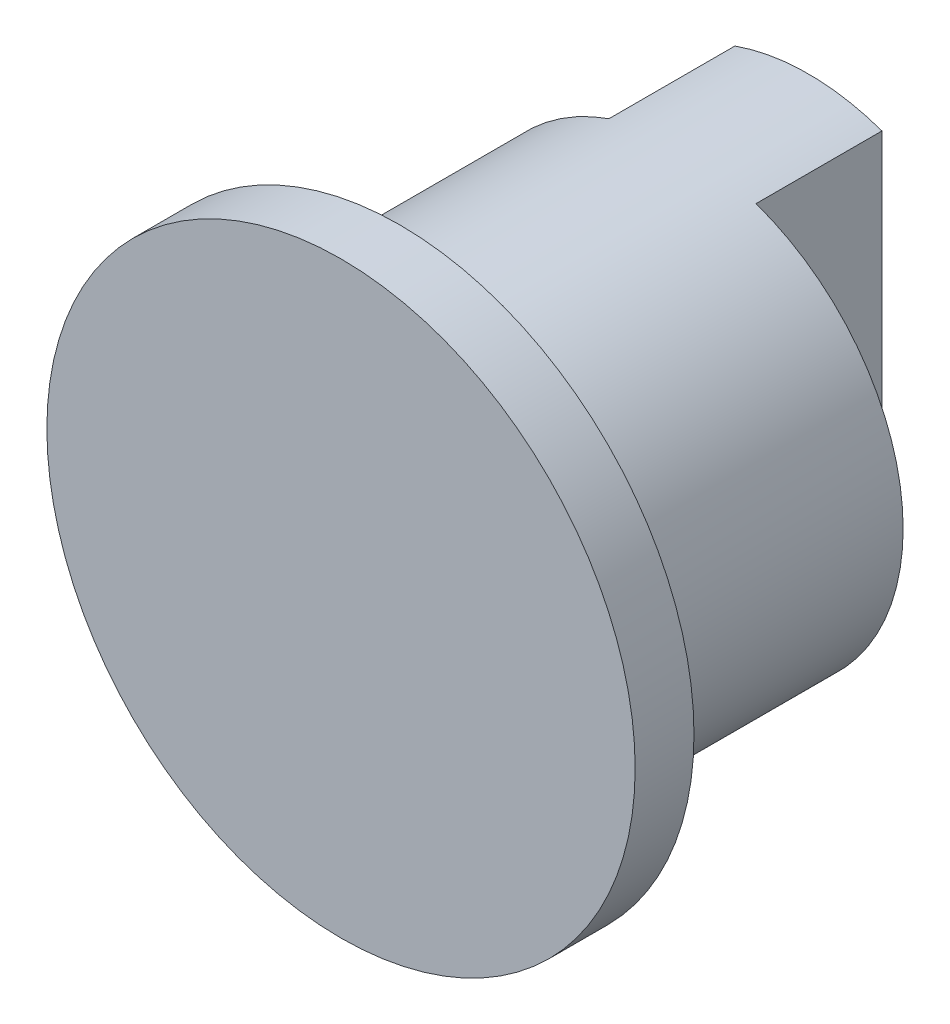
ISO-10303-21;
HEADER;
FILE_DESCRIPTION(('STEP AP214'),'2;1');
FILE_NAME('part.step','',(''),(''),'','','');
FILE_SCHEMA(('AUTOMOTIVE_DESIGN { 1 0 10303 214 1 1 1 1 }'));
ENDSEC;
DATA;
#1=APPLICATION_CONTEXT('core data for automotive mechanical design processes');
#2=APPLICATION_PROTOCOL_DEFINITION('international standard','automotive_design',2000,#1);
#3=PRODUCT_CONTEXT('',#1,'mechanical');
#4=PRODUCT('Part','Part','',(#3));
#5=PRODUCT_RELATED_PRODUCT_CATEGORY('part','',(#4));
#6=PRODUCT_DEFINITION_FORMATION('','',#4);
#7=PRODUCT_DEFINITION_CONTEXT('part definition',#1,'design');
#8=PRODUCT_DEFINITION('design','',#6,#7);
#9=PRODUCT_DEFINITION_SHAPE('','',#8);
#10=(LENGTH_UNIT() NAMED_UNIT(*) SI_UNIT(.MILLI.,.METRE.));
#11=(NAMED_UNIT(*) PLANE_ANGLE_UNIT() SI_UNIT($,.RADIAN.));
#12=(NAMED_UNIT(*) SI_UNIT($,.STERADIAN.) SOLID_ANGLE_UNIT());
#13=UNCERTAINTY_MEASURE_WITH_UNIT(LENGTH_MEASURE(1.E-05),#10,'distance_accuracy_value','');
#14=(GEOMETRIC_REPRESENTATION_CONTEXT(3) GLOBAL_UNCERTAINTY_ASSIGNED_CONTEXT((#13)) GLOBAL_UNIT_ASSIGNED_CONTEXT((#10,
#11,#12)) REPRESENTATION_CONTEXT('',''));
#15=CARTESIAN_POINT('',(0.,0.,0.));
#16=DIRECTION('',(0.,0.,1.));
#17=DIRECTION('',(1.,0.,0.));
#18=AXIS2_PLACEMENT_3D('',#15,#16,#17);
#19=CARTESIAN_POINT('',(0.,0.,10.09015));
#20=DIRECTION('',(0.,0.,-1.));
#21=DIRECTION('',(-1.,0.,0.));
#22=AXIS2_PLACEMENT_3D('',#19,#20,#21);
#23=CYLINDRICAL_SURFACE('',#22,4.7625);
#24=DIRECTION('',(0.,0.,-1.));
#25=VECTOR('',#24,1.);
#26=CARTESIAN_POINT('',(1.5875,-4.49012806053458,10.09015));
#27=LINE('',#26,#25);
#28=CARTESIAN_POINT('',(1.5875,-4.49012806053458,2.7178));
#29=VERTEX_POINT('',#28);
#30=CARTESIAN_POINT('',(1.5875,-4.49012806053458,0.));
#31=VERTEX_POINT('',#30);
#32=EDGE_CURVE('E48',#29,#31,#27,.T.);
#33=ORIENTED_EDGE('',*,*,#32,.F.);
#34=CARTESIAN_POINT('',(0.,0.,2.7178));
#35=DIRECTION('',(0.,0.,-1.));
#36=DIRECTION('',(-1.,0.,0.));
#37=AXIS2_PLACEMENT_3D('',#34,#35,#36);
#38=CIRCLE('',#37,4.7625);
#39=CARTESIAN_POINT('',(1.5875,4.49012806053458,2.7178));
#40=VERTEX_POINT('',#39);
#41=EDGE_CURVE('E74',#40,#29,#38,.T.);
#42=ORIENTED_EDGE('',*,*,#41,.F.);
#43=DIRECTION('',(0.,0.,-1.));
#44=VECTOR('',#43,1.);
#45=CARTESIAN_POINT('',(1.5875,4.49012806053458,10.09015));
#46=LINE('',#45,#44);
#47=CARTESIAN_POINT('',(1.5875,4.49012806053458,0.));
#48=VERTEX_POINT('',#47);
#49=EDGE_CURVE('E77',#48,#40,#46,.F.);
#50=ORIENTED_EDGE('',*,*,#49,.F.);
#51=CARTESIAN_POINT('',(0.,0.,0.));
#52=DIRECTION('',(0.,0.,1.));
#53=DIRECTION('',(1.,0.,0.));
#54=AXIS2_PLACEMENT_3D('',#51,#52,#53);
#55=CIRCLE('',#54,4.7625);
#56=CARTESIAN_POINT('',(-1.5875,4.49012806053458,0.));
#57=VERTEX_POINT('',#56);
#58=EDGE_CURVE('E56',#48,#57,#55,.T.);
#59=ORIENTED_EDGE('',*,*,#58,.T.);
#60=DIRECTION('',(0.,0.,-1.));
#61=VECTOR('',#60,1.);
#62=CARTESIAN_POINT('',(-1.5875,4.49012806053458,10.09015));
#63=LINE('',#62,#61);
#64=CARTESIAN_POINT('',(-1.5875,4.49012806053458,2.7178));
#65=VERTEX_POINT('',#64);
#66=EDGE_CURVE('E98',#65,#57,#63,.T.);
#67=ORIENTED_EDGE('',*,*,#66,.F.);
#68=CARTESIAN_POINT('',(0.,0.,2.7178));
#69=DIRECTION('',(0.,0.,-1.));
#70=DIRECTION('',(-1.,0.,0.));
#71=AXIS2_PLACEMENT_3D('',#68,#69,#70);
#72=CIRCLE('',#71,4.7625);
#73=CARTESIAN_POINT('',(-1.5875,-4.49012806053458,2.7178));
#74=VERTEX_POINT('',#73);
#75=EDGE_CURVE('E104',#74,#65,#72,.T.);
#76=ORIENTED_EDGE('',*,*,#75,.F.);
#77=DIRECTION('',(0.,0.,-1.));
#78=VECTOR('',#77,1.);
#79=CARTESIAN_POINT('',(-1.5875,-4.49012806053458,10.09015));
#80=LINE('',#79,#78);
#81=CARTESIAN_POINT('',(-1.5875,-4.49012806053458,0.));
#82=VERTEX_POINT('',#81);
#83=EDGE_CURVE('E96',#82,#74,#80,.F.);
#84=ORIENTED_EDGE('',*,*,#83,.F.);
#85=EDGE_CURVE('E100',#82,#31,#55,.T.);
#86=ORIENTED_EDGE('',*,*,#85,.T.);
#87=EDGE_LOOP('',(#33,#42,#50,#59,#67,#76,#84,#86));
#88=FACE_BOUND('',#87,.T.);
#89=CARTESIAN_POINT('',(0.,0.,8.82015));
#90=DIRECTION('',(0.,0.,1.));
#91=DIRECTION('',(1.,0.,0.));
#92=AXIS2_PLACEMENT_3D('',#89,#90,#91);
#93=CIRCLE('',#92,4.7625);
#94=CARTESIAN_POINT('',(4.7625,0.,8.82015));
#95=VERTEX_POINT('',#94);
#96=EDGE_CURVE('E11',#95,#95,#93,.T.);
#97=ORIENTED_EDGE('',*,*,#96,.F.);
#98=EDGE_LOOP('',(#97));
#99=FACE_BOUND('',#98,.T.);
#100=ADVANCED_FACE('F33',(#88,#99),#23,.T.);
#101=CARTESIAN_POINT('',(0.,0.,0.));
#102=DIRECTION('',(0.,0.,-1.));
#103=DIRECTION('',(-1.,0.,0.));
#104=AXIS2_PLACEMENT_3D('',#101,#102,#103);
#105=CYLINDRICAL_SURFACE('',#104,1.1303);
#106=CARTESIAN_POINT('',(0.,0.,0.));
#107=DIRECTION('',(0.,0.,-1.));
#108=DIRECTION('',(-1.,0.,0.));
#109=AXIS2_PLACEMENT_3D('',#106,#107,#108);
#110=CIRCLE('',#109,1.1303);
#111=CARTESIAN_POINT('',(-1.1303,0.,0.));
#112=VERTEX_POINT('',#111);
#113=EDGE_CURVE('E86',#112,#112,#110,.T.);
#114=ORIENTED_EDGE('',*,*,#113,.T.);
#115=EDGE_LOOP('',(#114));
#116=FACE_BOUND('',#115,.T.);
#117=CARTESIAN_POINT('',(0.,0.,8.82015));
#118=DIRECTION('',(0.,0.,1.));
#119=DIRECTION('',(1.,0.,0.));
#120=AXIS2_PLACEMENT_3D('',#117,#118,#119);
#121=CIRCLE('',#120,1.1303);
#122=CARTESIAN_POINT('',(1.1303,0.,8.82015));
#123=VERTEX_POINT('',#122);
#124=EDGE_CURVE('E36',#123,#123,#121,.F.);
#125=ORIENTED_EDGE('',*,*,#124,.F.);
#126=EDGE_LOOP('',(#125));
#127=FACE_BOUND('',#126,.T.);
#128=ADVANCED_FACE('F118',(#116,#127),#105,.F.);
#129=CARTESIAN_POINT('',(0.,0.,0.));
#130=DIRECTION('',(0.,0.,1.));
#131=DIRECTION('',(1.,0.,0.));
#132=AXIS2_PLACEMENT_3D('',#129,#130,#131);
#133=PLANE('',#132);
#134=ORIENTED_EDGE('',*,*,#113,.F.);
#135=EDGE_LOOP('',(#134));
#136=FACE_BOUND('',#135,.T.);
#137=DIRECTION('',(0.,1.,0.));
#138=VECTOR('',#137,1.);
#139=CARTESIAN_POINT('',(1.5875,0.,0.));
#140=LINE('',#139,#138);
#141=EDGE_CURVE('E81',#31,#48,#140,.T.);
#142=ORIENTED_EDGE('',*,*,#141,.F.);
#143=ORIENTED_EDGE('',*,*,#85,.F.);
#144=DIRECTION('',(0.,-1.,0.));
#145=VECTOR('',#144,1.);
#146=CARTESIAN_POINT('',(-1.5875,0.,0.));
#147=LINE('',#146,#145);
#148=EDGE_CURVE('E102',#57,#82,#147,.T.);
#149=ORIENTED_EDGE('',*,*,#148,.F.);
#150=ORIENTED_EDGE('',*,*,#58,.F.);
#151=EDGE_LOOP('',(#142,#143,#149,#150));
#152=FACE_BOUND('',#151,.T.);
#153=ADVANCED_FACE('F116',(#136,#152),#133,.F.);
#154=CARTESIAN_POINT('',(-4.7625,13.49375,2.7178));
#155=DIRECTION('',(0.,0.,-1.));
#156=DIRECTION('',(-1.,0.,0.));
#157=AXIS2_PLACEMENT_3D('',#154,#155,#156);
#158=PLANE('',#157);
#159=ORIENTED_EDGE('',*,*,#75,.T.);
#160=DIRECTION('',(0.,-1.,0.));
#161=VECTOR('',#160,1.);
#162=CARTESIAN_POINT('',(-1.5875,13.49375,2.7178));
#163=LINE('',#162,#161);
#164=EDGE_CURVE('E93',#65,#74,#163,.T.);
#165=ORIENTED_EDGE('',*,*,#164,.T.);
#166=EDGE_LOOP('',(#159,#165));
#167=FACE_BOUND('',#166,.T.);
#168=ADVANCED_FACE('F109',(#167),#158,.T.);
#169=CARTESIAN_POINT('',(-1.5875,13.49375,-0.4572));
#170=DIRECTION('',(-1.,0.,0.));
#171=DIRECTION('',(0.,0.,1.));
#172=AXIS2_PLACEMENT_3D('',#169,#170,#171);
#173=PLANE('',#172);
#174=ORIENTED_EDGE('',*,*,#66,.T.);
#175=ORIENTED_EDGE('',*,*,#148,.T.);
#176=ORIENTED_EDGE('',*,*,#83,.T.);
#177=ORIENTED_EDGE('',*,*,#164,.F.);
#178=EDGE_LOOP('',(#174,#175,#176,#177));
#179=FACE_BOUND('',#178,.T.);
#180=ADVANCED_FACE('F112',(#179),#173,.T.);
#181=CARTESIAN_POINT('',(4.7625,13.49375,2.7178));
#182=DIRECTION('',(0.,0.,-1.));
#183=DIRECTION('',(-1.,0.,0.));
#184=AXIS2_PLACEMENT_3D('',#181,#182,#183);
#185=PLANE('',#184);
#186=DIRECTION('',(0.,-1.,0.));
#187=VECTOR('',#186,1.);
#188=CARTESIAN_POINT('',(1.5875,13.49375,2.7178));
#189=LINE('',#188,#187);
#190=EDGE_CURVE('E83',#40,#29,#189,.T.);
#191=ORIENTED_EDGE('',*,*,#190,.F.);
#192=ORIENTED_EDGE('',*,*,#41,.T.);
#193=EDGE_LOOP('',(#191,#192));
#194=FACE_BOUND('',#193,.T.);
#195=ADVANCED_FACE('F85',(#194),#185,.T.);
#196=CARTESIAN_POINT('',(1.5875,13.49375,-0.4572));
#197=DIRECTION('',(1.,0.,0.));
#198=DIRECTION('',(0.,0.,-1.));
#199=AXIS2_PLACEMENT_3D('',#196,#197,#198);
#200=PLANE('',#199);
#201=ORIENTED_EDGE('',*,*,#32,.T.);
#202=ORIENTED_EDGE('',*,*,#141,.T.);
#203=ORIENTED_EDGE('',*,*,#49,.T.);
#204=ORIENTED_EDGE('',*,*,#190,.T.);
#205=EDGE_LOOP('',(#201,#202,#203,#204));
#206=FACE_BOUND('',#205,.T.);
#207=ADVANCED_FACE('F82',(#206),#200,.T.);
#208=CARTESIAN_POINT('',(0.,0.,8.82015));
#209=DIRECTION('',(0.,0.,1.));
#210=DIRECTION('',(1.,0.,0.));
#211=AXIS2_PLACEMENT_3D('',#208,#209,#210);
#212=PLANE('',#211);
#213=ORIENTED_EDGE('',*,*,#124,.T.);
#214=EDGE_LOOP('',(#213));
#215=FACE_BOUND('',#214,.T.);
#216=ADVANCED_FACE('F142',(#215),#212,.F.);
#217=CARTESIAN_POINT('',(0.,0.,8.82015));
#218=DIRECTION('',(0.,0.,1.));
#219=DIRECTION('',(1.,0.,0.));
#220=AXIS2_PLACEMENT_3D('',#217,#218,#219);
#221=CIRCLE('',#220,6.35);
#222=CARTESIAN_POINT('',(6.35,0.,8.82015));
#223=VERTEX_POINT('',#222);
#224=EDGE_CURVE('E89',#223,#223,#221,.T.);
#225=ORIENTED_EDGE('',*,*,#224,.F.);
#226=EDGE_LOOP('',(#225));
#227=FACE_BOUND('',#226,.T.);
#228=ORIENTED_EDGE('',*,*,#96,.T.);
#229=EDGE_LOOP('',(#228));
#230=FACE_BOUND('',#229,.T.);
#231=ADVANCED_FACE('F147',(#227,#230),#212,.F.);
#232=CARTESIAN_POINT('',(0.,0.,8.82015));
#233=DIRECTION('',(0.,0.,1.));
#234=DIRECTION('',(1.,0.,0.));
#235=AXIS2_PLACEMENT_3D('',#232,#233,#234);
#236=CYLINDRICAL_SURFACE('',#235,6.35);
#237=ORIENTED_EDGE('',*,*,#224,.T.);
#238=EDGE_LOOP('',(#237));
#239=FACE_BOUND('',#238,.T.);
#240=CARTESIAN_POINT('',(0.,0.,10.09015));
#241=DIRECTION('',(0.,0.,1.));
#242=DIRECTION('',(1.,0.,0.));
#243=AXIS2_PLACEMENT_3D('',#240,#241,#242);
#244=CIRCLE('',#243,6.35);
#245=CARTESIAN_POINT('',(6.35,0.,10.09015));
#246=VERTEX_POINT('',#245);
#247=EDGE_CURVE('E217',#246,#246,#244,.T.);
#248=ORIENTED_EDGE('',*,*,#247,.F.);
#249=EDGE_LOOP('',(#248));
#250=FACE_BOUND('',#249,.T.);
#251=ADVANCED_FACE('F158',(#239,#250),#236,.T.);
#252=CARTESIAN_POINT('',(0.,0.,10.09015));
#253=DIRECTION('',(0.,0.,1.));
#254=DIRECTION('',(1.,0.,0.));
#255=AXIS2_PLACEMENT_3D('',#252,#253,#254);
#256=PLANE('',#255);
#257=ORIENTED_EDGE('',*,*,#247,.T.);
#258=EDGE_LOOP('',(#257));
#259=FACE_BOUND('',#258,.T.);
#260=ADVANCED_FACE('F167',(#259),#256,.T.);
#261=CLOSED_SHELL('',(#100,#128,#153,#168,#180,#195,#207,#216,#231,#251,#260));
#262=MANIFOLD_SOLID_BREP('B2',#261);
#263=ADVANCED_BREP_SHAPE_REPRESENTATION('',(#18,#262),#14);
#264=SHAPE_DEFINITION_REPRESENTATION(#9,#263);
ENDSEC;
END-ISO-10303-21;
